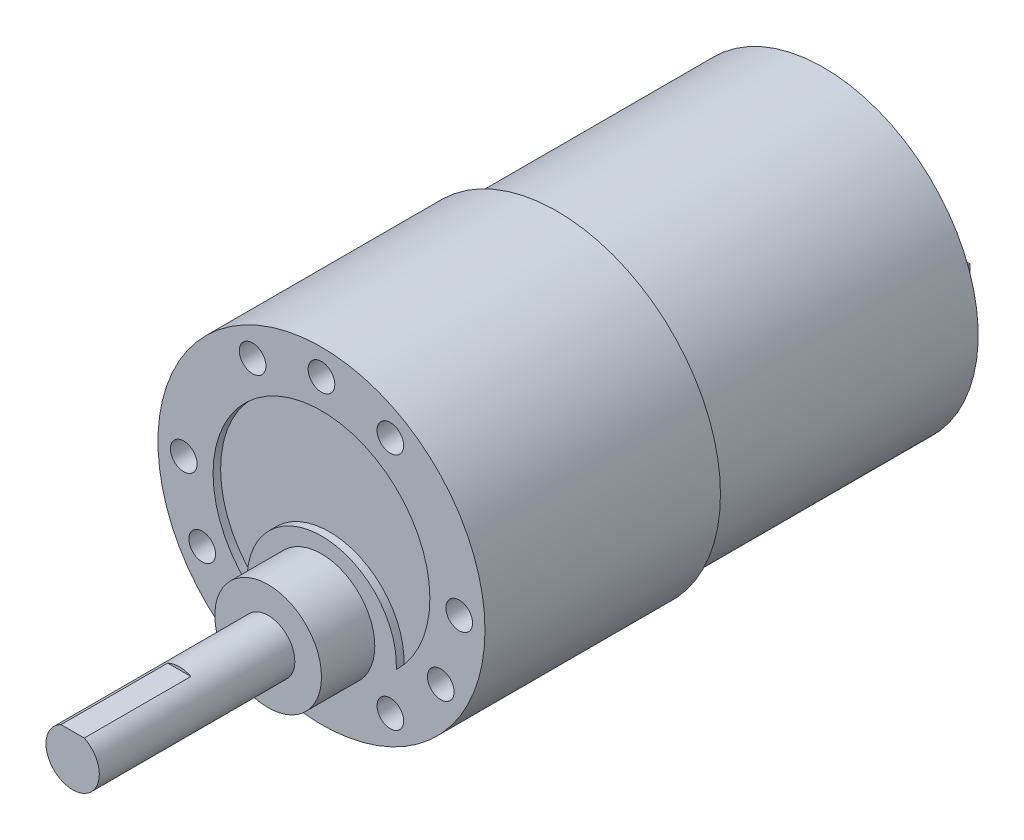
ISO-10303-21;
HEADER;
FILE_DESCRIPTION(('STEP AP214'),'2;1');
FILE_NAME('part.step','',(''),(''),'','','');
FILE_SCHEMA(('AUTOMOTIVE_DESIGN { 1 0 10303 214 1 1 1 1 }'));
ENDSEC;
DATA;
#1=APPLICATION_CONTEXT('core data for automotive mechanical design processes');
#2=APPLICATION_PROTOCOL_DEFINITION('international standard','automotive_design',2000,#1);
#3=PRODUCT_CONTEXT('',#1,'mechanical');
#4=PRODUCT('Part','Part','',(#3));
#5=PRODUCT_RELATED_PRODUCT_CATEGORY('part','',(#4));
#6=PRODUCT_DEFINITION_FORMATION('','',#4);
#7=PRODUCT_DEFINITION_CONTEXT('part definition',#1,'design');
#8=PRODUCT_DEFINITION('design','',#6,#7);
#9=PRODUCT_DEFINITION_SHAPE('','',#8);
#10=(LENGTH_UNIT() NAMED_UNIT(*) SI_UNIT(.MILLI.,.METRE.));
#11=(NAMED_UNIT(*) PLANE_ANGLE_UNIT() SI_UNIT($,.RADIAN.));
#12=(NAMED_UNIT(*) SI_UNIT($,.STERADIAN.) SOLID_ANGLE_UNIT());
#13=UNCERTAINTY_MEASURE_WITH_UNIT(LENGTH_MEASURE(1.E-05),#10,'distance_accuracy_value','');
#14=(GEOMETRIC_REPRESENTATION_CONTEXT(3) GLOBAL_UNCERTAINTY_ASSIGNED_CONTEXT((#13)) GLOBAL_UNIT_ASSIGNED_CONTEXT((#10,
#11,#12)) REPRESENTATION_CONTEXT('',''));
#15=CARTESIAN_POINT('',(0.,0.,0.));
#16=DIRECTION('',(0.,0.,1.));
#17=DIRECTION('',(1.,0.,0.));
#18=AXIS2_PLACEMENT_3D('',#15,#16,#17);
#19=CARTESIAN_POINT('',(0.,0.,-30.));
#20=DIRECTION('',(0.,0.,-1.));
#21=DIRECTION('',(-1.,0.,0.));
#22=AXIS2_PLACEMENT_3D('',#19,#20,#21);
#23=PLANE('',#22);
#24=CARTESIAN_POINT('',(11.25,0.,-30.));
#25=DIRECTION('',(0.,0.,-1.));
#26=DIRECTION('',(-1.,0.,0.));
#27=AXIS2_PLACEMENT_3D('',#24,#25,#26);
#28=CIRCLE('',#27,2.25);
#29=CARTESIAN_POINT('',(9.,0.,-30.));
#30=VERTEX_POINT('',#29);
#31=EDGE_CURVE('E215',#30,#30,#28,.T.);
#32=ORIENTED_EDGE('',*,*,#31,.F.);
#33=EDGE_LOOP('',(#32));
#34=FACE_BOUND('',#33,.T.);
#35=CARTESIAN_POINT('',(0.,0.,-30.));
#36=DIRECTION('',(0.,0.,-1.));
#37=DIRECTION('',(-1.,0.,0.));
#38=AXIS2_PLACEMENT_3D('',#35,#36,#37);
#39=CIRCLE('',#38,3.9);
#40=CARTESIAN_POINT('',(-3.9,0.,-30.));
#41=VERTEX_POINT('',#40);
#42=EDGE_CURVE('E12',#41,#41,#39,.T.);
#43=ORIENTED_EDGE('',*,*,#42,.F.);
#44=EDGE_LOOP('',(#43));
#45=FACE_BOUND('',#44,.T.);
#46=CARTESIAN_POINT('',(0.,0.,-30.));
#47=DIRECTION('',(0.,0.,-1.));
#48=DIRECTION('',(-1.,0.,0.));
#49=AXIS2_PLACEMENT_3D('',#46,#47,#48);
#50=CIRCLE('',#49,17.4);
#51=CARTESIAN_POINT('',(-17.4,0.,-30.));
#52=VERTEX_POINT('',#51);
#53=EDGE_CURVE('E223',#52,#52,#50,.T.);
#54=ORIENTED_EDGE('',*,*,#53,.T.);
#55=EDGE_LOOP('',(#54));
#56=FACE_BOUND('',#55,.T.);
#57=CARTESIAN_POINT('',(-11.25,0.,-30.));
#58=DIRECTION('',(0.,0.,-1.));
#59=DIRECTION('',(1.,0.,0.));
#60=AXIS2_PLACEMENT_3D('',#57,#58,#59);
#61=CIRCLE('',#60,2.25);
#62=CARTESIAN_POINT('',(-9.,0.,-30.));
#63=VERTEX_POINT('',#62);
#64=EDGE_CURVE('E197',#63,#63,#61,.T.);
#65=ORIENTED_EDGE('',*,*,#64,.F.);
#66=EDGE_LOOP('',(#65));
#67=FACE_BOUND('',#66,.T.);
#68=ADVANCED_FACE('F46',(#34,#45,#56,#67),#23,.T.);
#69=CARTESIAN_POINT('',(0.,0.,26.5));
#70=DIRECTION('',(0.,0.,-1.));
#71=DIRECTION('',(-1.,0.,0.));
#72=AXIS2_PLACEMENT_3D('',#69,#70,#71);
#73=CYLINDRICAL_SURFACE('',#72,18.4);
#74=CARTESIAN_POINT('',(0.,0.,26.5));
#75=DIRECTION('',(0.,0.,1.));
#76=DIRECTION('',(1.,0.,0.));
#77=AXIS2_PLACEMENT_3D('',#74,#75,#76);
#78=CIRCLE('',#77,18.4);
#79=CARTESIAN_POINT('',(18.4,0.,26.5));
#80=VERTEX_POINT('',#79);
#81=EDGE_CURVE('E247',#80,#80,#78,.T.);
#82=ORIENTED_EDGE('',*,*,#81,.F.);
#83=EDGE_LOOP('',(#82));
#84=FACE_BOUND('',#83,.T.);
#85=CARTESIAN_POINT('',(0.,0.,0.));
#86=DIRECTION('',(0.,0.,1.));
#87=DIRECTION('',(1.,0.,0.));
#88=AXIS2_PLACEMENT_3D('',#85,#86,#87);
#89=CIRCLE('',#88,18.4);
#90=CARTESIAN_POINT('',(18.4,0.,0.));
#91=VERTEX_POINT('',#90);
#92=EDGE_CURVE('E50',#91,#91,#89,.T.);
#93=ORIENTED_EDGE('',*,*,#92,.T.);
#94=EDGE_LOOP('',(#93));
#95=FACE_BOUND('',#94,.T.);
#96=ADVANCED_FACE('F48',(#84,#95),#73,.T.);
#97=CARTESIAN_POINT('',(0.,0.,26.5));
#98=DIRECTION('',(0.,0.,1.));
#99=DIRECTION('',(1.,0.,0.));
#100=AXIS2_PLACEMENT_3D('',#97,#98,#99);
#101=PLANE('',#100);
#102=CARTESIAN_POINT('',(-1.78589781851884E-12,-7.75000000000207,26.5));
#103=DIRECTION('',(0.,0.,1.));
#104=DIRECTION('',(1.,0.,0.));
#105=AXIS2_PLACEMENT_3D('',#102,#103,#104);
#106=CIRCLE('',#105,6.);
#107=CARTESIAN_POINT('',(5.99999999999821,-7.75000000000207,26.5));
#108=VERTEX_POINT('',#107);
#109=EDGE_CURVE('E244',#108,#108,#106,.T.);
#110=ORIENTED_EDGE('',*,*,#109,.F.);
#111=EDGE_LOOP('',(#110));
#112=FACE_BOUND('',#111,.T.);
#113=CARTESIAN_POINT('',(-15.5,0.,26.5));
#114=DIRECTION('',(0.,0.,1.));
#115=DIRECTION('',(1.,0.,0.));
#116=AXIS2_PLACEMENT_3D('',#113,#114,#115);
#117=CIRCLE('',#116,1.5);
#118=CARTESIAN_POINT('',(-14.,0.,26.5));
#119=VERTEX_POINT('',#118);
#120=EDGE_CURVE('E258',#119,#119,#117,.T.);
#121=ORIENTED_EDGE('',*,*,#120,.F.);
#122=EDGE_LOOP('',(#121));
#123=FACE_BOUND('',#122,.T.);
#124=CARTESIAN_POINT('',(-7.75000000000016,-13.4233937586587,26.5));
#125=DIRECTION('',(0.,0.,1.));
#126=DIRECTION('',(1.,0.,0.));
#127=AXIS2_PLACEMENT_3D('',#124,#125,#126);
#128=CIRCLE('',#127,1.5);
#129=CARTESIAN_POINT('',(-6.25000000000015,-13.4233937586587,26.5));
#130=VERTEX_POINT('',#129);
#131=EDGE_CURVE('E251',#130,#130,#128,.T.);
#132=ORIENTED_EDGE('',*,*,#131,.F.);
#133=EDGE_LOOP('',(#132));
#134=FACE_BOUND('',#133,.T.);
#135=CARTESIAN_POINT('',(7.74999999999987,-13.4233937586589,26.5));
#136=DIRECTION('',(0.,0.,1.));
#137=DIRECTION('',(1.,0.,0.));
#138=AXIS2_PLACEMENT_3D('',#135,#136,#137);
#139=CIRCLE('',#138,1.5);
#140=CARTESIAN_POINT('',(9.24999999999988,-13.4233937586589,26.5));
#141=VERTEX_POINT('',#140);
#142=EDGE_CURVE('E265',#141,#141,#139,.T.);
#143=ORIENTED_EDGE('',*,*,#142,.F.);
#144=EDGE_LOOP('',(#143));
#145=FACE_BOUND('',#144,.T.);
#146=CARTESIAN_POINT('',(15.5,-1.08235921504137E-13,26.5));
#147=DIRECTION('',(0.,0.,1.));
#148=DIRECTION('',(1.,0.,0.));
#149=AXIS2_PLACEMENT_3D('',#146,#147,#148);
#150=CIRCLE('',#149,1.5);
#151=CARTESIAN_POINT('',(17.,-1.08235921504137E-13,26.5));
#152=VERTEX_POINT('',#151);
#153=EDGE_CURVE('E282',#152,#152,#150,.T.);
#154=ORIENTED_EDGE('',*,*,#153,.F.);
#155=EDGE_LOOP('',(#154));
#156=FACE_BOUND('',#155,.T.);
#157=CARTESIAN_POINT('',(7.75000000000006,13.4233937586588,26.5));
#158=DIRECTION('',(0.,0.,1.));
#159=DIRECTION('',(1.,0.,0.));
#160=AXIS2_PLACEMENT_3D('',#157,#158,#159);
#161=CIRCLE('',#160,1.5);
#162=CARTESIAN_POINT('',(9.25000000000006,13.4233937586588,26.5));
#163=VERTEX_POINT('',#162);
#164=EDGE_CURVE('E276',#163,#163,#161,.T.);
#165=ORIENTED_EDGE('',*,*,#164,.F.);
#166=EDGE_LOOP('',(#165));
#167=FACE_BOUND('',#166,.T.);
#168=CARTESIAN_POINT('',(-7.74999999999997,13.4233937586588,26.5));
#169=DIRECTION('',(0.,0.,1.));
#170=DIRECTION('',(1.,0.,0.));
#171=AXIS2_PLACEMENT_3D('',#168,#169,#170);
#172=CIRCLE('',#171,1.5);
#173=CARTESIAN_POINT('',(-6.24999999999997,13.4233937586588,26.5));
#174=VERTEX_POINT('',#173);
#175=EDGE_CURVE('E270',#174,#174,#172,.T.);
#176=ORIENTED_EDGE('',*,*,#175,.F.);
#177=EDGE_LOOP('',(#176));
#178=FACE_BOUND('',#177,.T.);
#179=CARTESIAN_POINT('',(0.,15.5,26.5));
#180=DIRECTION('',(0.,0.,1.));
#181=DIRECTION('',(1.,0.,0.));
#182=AXIS2_PLACEMENT_3D('',#179,#180,#181);
#183=CIRCLE('',#182,1.5);
#184=CARTESIAN_POINT('',(1.5,15.5,26.5));
#185=VERTEX_POINT('',#184);
#186=EDGE_CURVE('E294',#185,#185,#183,.T.);
#187=ORIENTED_EDGE('',*,*,#186,.F.);
#188=EDGE_LOOP('',(#187));
#189=FACE_BOUND('',#188,.T.);
#190=CARTESIAN_POINT('',(13.4233937586576,-7.75000000000207,26.5));
#191=DIRECTION('',(0.,0.,1.));
#192=DIRECTION('',(1.,0.,0.));
#193=AXIS2_PLACEMENT_3D('',#190,#191,#192);
#194=CIRCLE('',#193,1.49999999999779);
#195=CARTESIAN_POINT('',(14.9233937586554,-7.75000000000207,26.5));
#196=VERTEX_POINT('',#195);
#197=EDGE_CURVE('E300',#196,#196,#194,.T.);
#198=ORIENTED_EDGE('',*,*,#197,.F.);
#199=EDGE_LOOP('',(#198));
#200=FACE_BOUND('',#199,.T.);
#201=CARTESIAN_POINT('',(-13.4233937586612,-7.74999999999587,26.5));
#202=DIRECTION('',(0.,0.,1.));
#203=DIRECTION('',(1.,0.,0.));
#204=AXIS2_PLACEMENT_3D('',#201,#202,#203);
#205=CIRCLE('',#204,1.49999999999558);
#206=CARTESIAN_POINT('',(-11.9233937586656,-7.74999999999587,26.5));
#207=VERTEX_POINT('',#206);
#208=EDGE_CURVE('E257',#207,#207,#205,.T.);
#209=ORIENTED_EDGE('',*,*,#208,.F.);
#210=EDGE_LOOP('',(#209));
#211=FACE_BOUND('',#210,.T.);
#212=CARTESIAN_POINT('',(0.0300122031200254,-8.39994638480889,26.5));
#213=DIRECTION('',(0.,0.,1.));
#214=DIRECTION('',(1.,0.,0.));
#215=AXIS2_PLACEMENT_3D('',#212,#213,#214);
#216=CIRCLE('',#215,8.4);
#217=CARTESIAN_POINT('',(-8.35571384552702,-8.88943452260424,26.5));
#218=VERTEX_POINT('',#217);
#219=CARTESIAN_POINT('',(8.41902189984086,-8.8295,26.5));
#220=VERTEX_POINT('',#219);
#221=EDGE_CURVE('E71',#218,#220,#216,.F.);
#222=ORIENTED_EDGE('',*,*,#221,.F.);
#223=CARTESIAN_POINT('',(0.,0.,26.5));
#224=DIRECTION('',(0.,0.,1.));
#225=DIRECTION('',(1.,0.,0.));
#226=AXIS2_PLACEMENT_3D('',#223,#224,#225);
#227=CIRCLE('',#226,12.2);
#228=EDGE_CURVE('E293',#220,#218,#227,.T.);
#229=ORIENTED_EDGE('',*,*,#228,.F.);
#230=EDGE_LOOP('',(#222,#229));
#231=FACE_BOUND('',#230,.T.);
#232=ORIENTED_EDGE('',*,*,#81,.T.);
#233=EDGE_LOOP('',(#232));
#234=FACE_BOUND('',#233,.T.);
#235=ADVANCED_FACE('F330',(#112,#123,#134,#145,#156,#167,#178,#189,#200,#211,#231,#234),#101,.T.);
#236=CARTESIAN_POINT('',(0.,0.,0.));
#237=DIRECTION('',(0.,0.,1.));
#238=DIRECTION('',(1.,0.,0.));
#239=AXIS2_PLACEMENT_3D('',#236,#237,#238);
#240=PLANE('',#239);
#241=CARTESIAN_POINT('',(0.,0.,0.));
#242=DIRECTION('',(0.,0.,-1.));
#243=DIRECTION('',(-1.,0.,0.));
#244=AXIS2_PLACEMENT_3D('',#241,#242,#243);
#245=CIRCLE('',#244,17.4);
#246=CARTESIAN_POINT('',(-17.4,0.,0.));
#247=VERTEX_POINT('',#246);
#248=EDGE_CURVE('E55',#247,#247,#245,.T.);
#249=ORIENTED_EDGE('',*,*,#248,.F.);
#250=EDGE_LOOP('',(#249));
#251=FACE_BOUND('',#250,.T.);
#252=ORIENTED_EDGE('',*,*,#92,.F.);
#253=EDGE_LOOP('',(#252));
#254=FACE_BOUND('',#253,.T.);
#255=ADVANCED_FACE('F327',(#251,#254),#240,.F.);
#256=CARTESIAN_POINT('',(0.0300122031200254,-8.39994638480889,25.65));
#257=DIRECTION('',(0.,0.,1.));
#258=DIRECTION('',(1.,0.,0.));
#259=AXIS2_PLACEMENT_3D('',#256,#257,#258);
#260=CYLINDRICAL_SURFACE('',#259,8.4);
#261=ORIENTED_EDGE('',*,*,#221,.T.);
#262=DIRECTION('',(0.,0.,1.));
#263=VECTOR('',#262,1.);
#264=CARTESIAN_POINT('',(8.41902189984086,-8.8295,25.65));
#265=LINE('',#264,#263);
#266=CARTESIAN_POINT('',(8.41902189984086,-8.8295,25.65));
#267=VERTEX_POINT('',#266);
#268=EDGE_CURVE('E318',#267,#220,#265,.T.);
#269=ORIENTED_EDGE('',*,*,#268,.F.);
#270=CARTESIAN_POINT('',(0.0300122031200254,-8.39994638480889,25.65));
#271=DIRECTION('',(0.,0.,1.));
#272=DIRECTION('',(1.,0.,0.));
#273=AXIS2_PLACEMENT_3D('',#270,#271,#272);
#274=CIRCLE('',#273,8.4);
#275=CARTESIAN_POINT('',(-8.35571384552702,-8.88943452260424,25.65));
#276=VERTEX_POINT('',#275);
#277=EDGE_CURVE('E311',#276,#267,#274,.F.);
#278=ORIENTED_EDGE('',*,*,#277,.F.);
#279=DIRECTION('',(0.,0.,1.));
#280=VECTOR('',#279,1.);
#281=CARTESIAN_POINT('',(-8.35571384552702,-8.88943452260424,25.65));
#282=LINE('',#281,#280);
#283=EDGE_CURVE('E314',#276,#218,#282,.T.);
#284=ORIENTED_EDGE('',*,*,#283,.T.);
#285=EDGE_LOOP('',(#261,#269,#278,#284));
#286=FACE_BOUND('',#285,.T.);
#287=ADVANCED_FACE('F329',(#286),#260,.T.);
#288=CARTESIAN_POINT('',(0.,0.,25.65));
#289=DIRECTION('',(0.,0.,1.));
#290=DIRECTION('',(1.,0.,0.));
#291=AXIS2_PLACEMENT_3D('',#288,#289,#290);
#292=CYLINDRICAL_SURFACE('',#291,12.2);
#293=ORIENTED_EDGE('',*,*,#228,.T.);
#294=ORIENTED_EDGE('',*,*,#283,.F.);
#295=CARTESIAN_POINT('',(0.,0.,25.65));
#296=DIRECTION('',(0.,0.,1.));
#297=DIRECTION('',(1.,0.,0.));
#298=AXIS2_PLACEMENT_3D('',#295,#296,#297);
#299=CIRCLE('',#298,12.2);
#300=EDGE_CURVE('E308',#267,#276,#299,.T.);
#301=ORIENTED_EDGE('',*,*,#300,.F.);
#302=ORIENTED_EDGE('',*,*,#268,.T.);
#303=EDGE_LOOP('',(#293,#294,#301,#302));
#304=FACE_BOUND('',#303,.T.);
#305=ADVANCED_FACE('F336',(#304),#292,.F.);
#306=CARTESIAN_POINT('',(0.,0.,25.65));
#307=DIRECTION('',(0.,0.,1.));
#308=DIRECTION('',(1.,0.,0.));
#309=AXIS2_PLACEMENT_3D('',#306,#307,#308);
#310=PLANE('',#309);
#311=ORIENTED_EDGE('',*,*,#300,.T.);
#312=ORIENTED_EDGE('',*,*,#277,.T.);
#313=EDGE_LOOP('',(#311,#312));
#314=FACE_BOUND('',#313,.T.);
#315=ADVANCED_FACE('F452',(#314),#310,.T.);
#316=CARTESIAN_POINT('',(-13.4233937586612,-7.74999999999587,1.5));
#317=DIRECTION('',(0.,0.,1.));
#318=DIRECTION('',(1.,0.,0.));
#319=AXIS2_PLACEMENT_3D('',#316,#317,#318);
#320=CYLINDRICAL_SURFACE('',#319,1.49999999999558);
#321=CARTESIAN_POINT('',(-13.4233937586612,-7.74999999999587,1.5));
#322=DIRECTION('',(0.,0.,1.));
#323=DIRECTION('',(1.,0.,0.));
#324=AXIS2_PLACEMENT_3D('',#321,#322,#323);
#325=CIRCLE('',#324,1.49999999999558);
#326=CARTESIAN_POINT('',(-11.9233937586656,-7.74999999999587,1.5));
#327=VERTEX_POINT('',#326);
#328=EDGE_CURVE('E303',#327,#327,#325,.T.);
#329=ORIENTED_EDGE('',*,*,#328,.F.);
#330=EDGE_LOOP('',(#329));
#331=FACE_BOUND('',#330,.T.);
#332=ORIENTED_EDGE('',*,*,#208,.T.);
#333=EDGE_LOOP('',(#332));
#334=FACE_BOUND('',#333,.T.);
#335=ADVANCED_FACE('F448',(#331,#334),#320,.F.);
#336=CARTESIAN_POINT('',(-13.4233937586612,-7.74999999999587,1.5));
#337=DIRECTION('',(0.,0.,1.));
#338=DIRECTION('',(1.,0.,0.));
#339=AXIS2_PLACEMENT_3D('',#336,#337,#338);
#340=PLANE('',#339);
#341=ORIENTED_EDGE('',*,*,#328,.T.);
#342=EDGE_LOOP('',(#341));
#343=FACE_BOUND('',#342,.T.);
#344=ADVANCED_FACE('F444',(#343),#340,.T.);
#345=CARTESIAN_POINT('',(13.4233937586576,-7.75000000000207,1.5));
#346=DIRECTION('',(0.,0.,1.));
#347=DIRECTION('',(1.,0.,0.));
#348=AXIS2_PLACEMENT_3D('',#345,#346,#347);
#349=CYLINDRICAL_SURFACE('',#348,1.49999999999779);
#350=CARTESIAN_POINT('',(13.4233937586576,-7.75000000000207,1.5));
#351=DIRECTION('',(0.,0.,1.));
#352=DIRECTION('',(1.,0.,0.));
#353=AXIS2_PLACEMENT_3D('',#350,#351,#352);
#354=CIRCLE('',#353,1.49999999999779);
#355=CARTESIAN_POINT('',(14.9233937586554,-7.75000000000207,1.5));
#356=VERTEX_POINT('',#355);
#357=EDGE_CURVE('E297',#356,#356,#354,.T.);
#358=ORIENTED_EDGE('',*,*,#357,.F.);
#359=EDGE_LOOP('',(#358));
#360=FACE_BOUND('',#359,.T.);
#361=ORIENTED_EDGE('',*,*,#197,.T.);
#362=EDGE_LOOP('',(#361));
#363=FACE_BOUND('',#362,.T.);
#364=ADVANCED_FACE('F440',(#360,#363),#349,.F.);
#365=CARTESIAN_POINT('',(13.4233937586576,-7.75000000000207,1.5));
#366=DIRECTION('',(0.,0.,1.));
#367=DIRECTION('',(1.,0.,0.));
#368=AXIS2_PLACEMENT_3D('',#365,#366,#367);
#369=PLANE('',#368);
#370=ORIENTED_EDGE('',*,*,#357,.T.);
#371=EDGE_LOOP('',(#370));
#372=FACE_BOUND('',#371,.T.);
#373=ADVANCED_FACE('F436',(#372),#369,.T.);
#374=CARTESIAN_POINT('',(0.,15.5,1.5));
#375=DIRECTION('',(0.,0.,1.));
#376=DIRECTION('',(1.,0.,0.));
#377=AXIS2_PLACEMENT_3D('',#374,#375,#376);
#378=CYLINDRICAL_SURFACE('',#377,1.5);
#379=CARTESIAN_POINT('',(0.,15.5,1.5));
#380=DIRECTION('',(0.,0.,1.));
#381=DIRECTION('',(1.,0.,0.));
#382=AXIS2_PLACEMENT_3D('',#379,#380,#381);
#383=CIRCLE('',#382,1.5);
#384=CARTESIAN_POINT('',(1.5,15.5,1.5));
#385=VERTEX_POINT('',#384);
#386=EDGE_CURVE('E290',#385,#385,#383,.T.);
#387=ORIENTED_EDGE('',*,*,#386,.F.);
#388=EDGE_LOOP('',(#387));
#389=FACE_BOUND('',#388,.T.);
#390=ORIENTED_EDGE('',*,*,#186,.T.);
#391=EDGE_LOOP('',(#390));
#392=FACE_BOUND('',#391,.T.);
#393=ADVANCED_FACE('F432',(#389,#392),#378,.F.);
#394=CARTESIAN_POINT('',(0.,15.5,1.5));
#395=DIRECTION('',(0.,0.,1.));
#396=DIRECTION('',(1.,0.,0.));
#397=AXIS2_PLACEMENT_3D('',#394,#395,#396);
#398=PLANE('',#397);
#399=ORIENTED_EDGE('',*,*,#386,.T.);
#400=EDGE_LOOP('',(#399));
#401=FACE_BOUND('',#400,.T.);
#402=ADVANCED_FACE('F406',(#401),#398,.T.);
#403=CARTESIAN_POINT('',(-7.74999999999997,13.4233937586588,21.5));
#404=DIRECTION('',(0.,0.,1.));
#405=DIRECTION('',(1.,0.,0.));
#406=AXIS2_PLACEMENT_3D('',#403,#404,#405);
#407=CYLINDRICAL_SURFACE('',#406,1.5);
#408=CARTESIAN_POINT('',(-7.74999999999997,13.4233937586588,21.5));
#409=DIRECTION('',(0.,0.,1.));
#410=DIRECTION('',(1.,0.,0.));
#411=AXIS2_PLACEMENT_3D('',#408,#409,#410);
#412=CIRCLE('',#411,1.5);
#413=CARTESIAN_POINT('',(-6.24999999999997,13.4233937586588,21.5));
#414=VERTEX_POINT('',#413);
#415=EDGE_CURVE('E261',#414,#414,#412,.T.);
#416=ORIENTED_EDGE('',*,*,#415,.F.);
#417=EDGE_LOOP('',(#416));
#418=FACE_BOUND('',#417,.T.);
#419=ORIENTED_EDGE('',*,*,#175,.T.);
#420=EDGE_LOOP('',(#419));
#421=FACE_BOUND('',#420,.T.);
#422=ADVANCED_FACE('F402',(#418,#421),#407,.F.);
#423=CARTESIAN_POINT('',(-7.74999999999997,13.4233937586588,21.5));
#424=DIRECTION('',(0.,0.,1.));
#425=DIRECTION('',(1.,0.,0.));
#426=AXIS2_PLACEMENT_3D('',#423,#424,#425);
#427=PLANE('',#426);
#428=ORIENTED_EDGE('',*,*,#415,.T.);
#429=EDGE_LOOP('',(#428));
#430=FACE_BOUND('',#429,.T.);
#431=ADVANCED_FACE('F398',(#430),#427,.T.);
#432=CARTESIAN_POINT('',(7.75000000000006,13.4233937586588,21.5));
#433=DIRECTION('',(0.,0.,1.));
#434=DIRECTION('',(1.,0.,0.));
#435=AXIS2_PLACEMENT_3D('',#432,#433,#434);
#436=CYLINDRICAL_SURFACE('',#435,1.5);
#437=CARTESIAN_POINT('',(7.75000000000006,13.4233937586588,21.5));
#438=DIRECTION('',(0.,0.,1.));
#439=DIRECTION('',(1.,0.,0.));
#440=AXIS2_PLACEMENT_3D('',#437,#438,#439);
#441=CIRCLE('',#440,1.5);
#442=CARTESIAN_POINT('',(9.25000000000006,13.4233937586588,21.5));
#443=VERTEX_POINT('',#442);
#444=EDGE_CURVE('E273',#443,#443,#441,.T.);
#445=ORIENTED_EDGE('',*,*,#444,.F.);
#446=EDGE_LOOP('',(#445));
#447=FACE_BOUND('',#446,.T.);
#448=ORIENTED_EDGE('',*,*,#164,.T.);
#449=EDGE_LOOP('',(#448));
#450=FACE_BOUND('',#449,.T.);
#451=ADVANCED_FACE('F401',(#447,#450),#436,.F.);
#452=CARTESIAN_POINT('',(7.75000000000006,13.4233937586588,21.5));
#453=DIRECTION('',(0.,0.,1.));
#454=DIRECTION('',(1.,0.,0.));
#455=AXIS2_PLACEMENT_3D('',#452,#453,#454);
#456=PLANE('',#455);
#457=ORIENTED_EDGE('',*,*,#444,.T.);
#458=EDGE_LOOP('',(#457));
#459=FACE_BOUND('',#458,.T.);
#460=ADVANCED_FACE('F408',(#459),#456,.T.);
#461=CARTESIAN_POINT('',(15.5,-1.08235921504137E-13,21.5));
#462=DIRECTION('',(0.,0.,1.));
#463=DIRECTION('',(1.,0.,0.));
#464=AXIS2_PLACEMENT_3D('',#461,#462,#463);
#465=CYLINDRICAL_SURFACE('',#464,1.5);
#466=CARTESIAN_POINT('',(15.5,-1.08235921504137E-13,21.5));
#467=DIRECTION('',(0.,0.,1.));
#468=DIRECTION('',(1.,0.,0.));
#469=AXIS2_PLACEMENT_3D('',#466,#467,#468);
#470=CIRCLE('',#469,1.5);
#471=CARTESIAN_POINT('',(17.,-1.08235921504137E-13,21.5));
#472=VERTEX_POINT('',#471);
#473=EDGE_CURVE('E279',#472,#472,#470,.T.);
#474=ORIENTED_EDGE('',*,*,#473,.F.);
#475=EDGE_LOOP('',(#474));
#476=FACE_BOUND('',#475,.T.);
#477=ORIENTED_EDGE('',*,*,#153,.T.);
#478=EDGE_LOOP('',(#477));
#479=FACE_BOUND('',#478,.T.);
#480=ADVANCED_FACE('F411',(#476,#479),#465,.F.);
#481=CARTESIAN_POINT('',(15.5,-1.08235921504137E-13,21.5));
#482=DIRECTION('',(0.,0.,1.));
#483=DIRECTION('',(1.,0.,0.));
#484=AXIS2_PLACEMENT_3D('',#481,#482,#483);
#485=PLANE('',#484);
#486=ORIENTED_EDGE('',*,*,#473,.T.);
#487=EDGE_LOOP('',(#486));
#488=FACE_BOUND('',#487,.T.);
#489=ADVANCED_FACE('F416',(#488),#485,.T.);
#490=CARTESIAN_POINT('',(7.74999999999987,-13.4233937586589,21.5));
#491=DIRECTION('',(0.,0.,1.));
#492=DIRECTION('',(1.,0.,0.));
#493=AXIS2_PLACEMENT_3D('',#490,#491,#492);
#494=CYLINDRICAL_SURFACE('',#493,1.5);
#495=CARTESIAN_POINT('',(7.74999999999987,-13.4233937586589,21.5));
#496=DIRECTION('',(0.,0.,1.));
#497=DIRECTION('',(1.,0.,0.));
#498=AXIS2_PLACEMENT_3D('',#495,#496,#497);
#499=CIRCLE('',#498,1.5);
#500=CARTESIAN_POINT('',(9.24999999999988,-13.4233937586589,21.5));
#501=VERTEX_POINT('',#500);
#502=EDGE_CURVE('E285',#501,#501,#499,.T.);
#503=ORIENTED_EDGE('',*,*,#502,.F.);
#504=EDGE_LOOP('',(#503));
#505=FACE_BOUND('',#504,.T.);
#506=ORIENTED_EDGE('',*,*,#142,.T.);
#507=EDGE_LOOP('',(#506));
#508=FACE_BOUND('',#507,.T.);
#509=ADVANCED_FACE('F419',(#505,#508),#494,.F.);
#510=CARTESIAN_POINT('',(7.74999999999987,-13.4233937586589,21.5));
#511=DIRECTION('',(0.,0.,1.));
#512=DIRECTION('',(1.,0.,0.));
#513=AXIS2_PLACEMENT_3D('',#510,#511,#512);
#514=PLANE('',#513);
#515=ORIENTED_EDGE('',*,*,#502,.T.);
#516=EDGE_LOOP('',(#515));
#517=FACE_BOUND('',#516,.T.);
#518=ADVANCED_FACE('F396',(#517),#514,.T.);
#519=CARTESIAN_POINT('',(-7.75000000000016,-13.4233937586587,21.5));
#520=DIRECTION('',(0.,0.,1.));
#521=DIRECTION('',(1.,0.,0.));
#522=AXIS2_PLACEMENT_3D('',#519,#520,#521);
#523=CYLINDRICAL_SURFACE('',#522,1.5);
#524=CARTESIAN_POINT('',(-7.75000000000016,-13.4233937586587,21.5));
#525=DIRECTION('',(0.,0.,1.));
#526=DIRECTION('',(1.,0.,0.));
#527=AXIS2_PLACEMENT_3D('',#524,#525,#526);
#528=CIRCLE('',#527,1.5);
#529=CARTESIAN_POINT('',(-6.25000000000015,-13.4233937586587,21.5));
#530=VERTEX_POINT('',#529);
#531=EDGE_CURVE('E262',#530,#530,#528,.T.);
#532=ORIENTED_EDGE('',*,*,#531,.F.);
#533=EDGE_LOOP('',(#532));
#534=FACE_BOUND('',#533,.T.);
#535=ORIENTED_EDGE('',*,*,#131,.T.);
#536=EDGE_LOOP('',(#535));
#537=FACE_BOUND('',#536,.T.);
#538=ADVANCED_FACE('F392',(#534,#537),#523,.F.);
#539=CARTESIAN_POINT('',(-7.75000000000016,-13.4233937586587,21.5));
#540=DIRECTION('',(0.,0.,1.));
#541=DIRECTION('',(1.,0.,0.));
#542=AXIS2_PLACEMENT_3D('',#539,#540,#541);
#543=PLANE('',#542);
#544=ORIENTED_EDGE('',*,*,#531,.T.);
#545=EDGE_LOOP('',(#544));
#546=FACE_BOUND('',#545,.T.);
#547=ADVANCED_FACE('F388',(#546),#543,.T.);
#548=CARTESIAN_POINT('',(-15.5,0.,21.5));
#549=DIRECTION('',(0.,0.,1.));
#550=DIRECTION('',(1.,0.,0.));
#551=AXIS2_PLACEMENT_3D('',#548,#549,#550);
#552=CYLINDRICAL_SURFACE('',#551,1.5);
#553=CARTESIAN_POINT('',(-15.5,0.,21.5));
#554=DIRECTION('',(0.,0.,1.));
#555=DIRECTION('',(1.,0.,0.));
#556=AXIS2_PLACEMENT_3D('',#553,#554,#555);
#557=CIRCLE('',#556,1.5);
#558=CARTESIAN_POINT('',(-14.,0.,21.5));
#559=VERTEX_POINT('',#558);
#560=EDGE_CURVE('E254',#559,#559,#557,.T.);
#561=ORIENTED_EDGE('',*,*,#560,.F.);
#562=EDGE_LOOP('',(#561));
#563=FACE_BOUND('',#562,.T.);
#564=ORIENTED_EDGE('',*,*,#120,.T.);
#565=EDGE_LOOP('',(#564));
#566=FACE_BOUND('',#565,.T.);
#567=ADVANCED_FACE('F384',(#563,#566),#552,.F.);
#568=CARTESIAN_POINT('',(-15.5,0.,21.5));
#569=DIRECTION('',(0.,0.,1.));
#570=DIRECTION('',(1.,0.,0.));
#571=AXIS2_PLACEMENT_3D('',#568,#569,#570);
#572=PLANE('',#571);
#573=ORIENTED_EDGE('',*,*,#560,.T.);
#574=EDGE_LOOP('',(#573));
#575=FACE_BOUND('',#574,.T.);
#576=ADVANCED_FACE('F380',(#575),#572,.T.);
#577=CARTESIAN_POINT('',(-1.78589781851884E-12,-7.75000000000207,32.5));
#578=DIRECTION('',(0.,0.,-1.));
#579=DIRECTION('',(-1.,0.,0.));
#580=AXIS2_PLACEMENT_3D('',#577,#578,#579);
#581=CYLINDRICAL_SURFACE('',#580,6.);
#582=CARTESIAN_POINT('',(-1.78589781851884E-12,-7.75000000000207,32.5));
#583=DIRECTION('',(0.,0.,1.));
#584=DIRECTION('',(1.,0.,0.));
#585=AXIS2_PLACEMENT_3D('',#582,#583,#584);
#586=CIRCLE('',#585,6.);
#587=CARTESIAN_POINT('',(5.99999999999821,-7.75000000000207,32.5));
#588=VERTEX_POINT('',#587);
#589=EDGE_CURVE('E248',#588,#588,#586,.T.);
#590=ORIENTED_EDGE('',*,*,#589,.F.);
#591=EDGE_LOOP('',(#590));
#592=FACE_BOUND('',#591,.T.);
#593=ORIENTED_EDGE('',*,*,#109,.T.);
#594=EDGE_LOOP('',(#593));
#595=FACE_BOUND('',#594,.T.);
#596=ADVANCED_FACE('F376',(#592,#595),#581,.T.);
#597=CARTESIAN_POINT('',(-1.78589781851884E-12,-7.75000000000207,32.5));
#598=DIRECTION('',(0.,0.,1.));
#599=DIRECTION('',(1.,0.,0.));
#600=AXIS2_PLACEMENT_3D('',#597,#598,#599);
#601=PLANE('',#600);
#602=CARTESIAN_POINT('',(-1.78589781851884E-12,-7.75000000000207,32.5));
#603=DIRECTION('',(0.,0.,1.));
#604=DIRECTION('',(1.,0.,0.));
#605=AXIS2_PLACEMENT_3D('',#602,#603,#604);
#606=CIRCLE('',#605,3.);
#607=CARTESIAN_POINT('',(2.99999999999821,-7.75000000000207,32.5));
#608=VERTEX_POINT('',#607);
#609=EDGE_CURVE('E230',#608,#608,#606,.T.);
#610=ORIENTED_EDGE('',*,*,#609,.F.);
#611=EDGE_LOOP('',(#610));
#612=FACE_BOUND('',#611,.T.);
#613=ORIENTED_EDGE('',*,*,#589,.T.);
#614=EDGE_LOOP('',(#613));
#615=FACE_BOUND('',#614,.T.);
#616=ADVANCED_FACE('F372',(#612,#615),#601,.T.);
#617=CARTESIAN_POINT('',(-1.78589781851884E-12,-7.75000000000207,54.5));
#618=DIRECTION('',(0.,0.,-1.));
#619=DIRECTION('',(-1.,0.,0.));
#620=AXIS2_PLACEMENT_3D('',#617,#618,#619);
#621=CYLINDRICAL_SURFACE('',#620,3.);
#622=CARTESIAN_POINT('',(-1.78589781851884E-12,-7.75000000000207,54.5));
#623=DIRECTION('',(0.,0.,1.));
#624=DIRECTION('',(1.,0.,0.));
#625=AXIS2_PLACEMENT_3D('',#622,#623,#624);
#626=CIRCLE('',#625,3.);
#627=CARTESIAN_POINT('',(-1.30766968306399,-5.05000000000207,54.5));
#628=VERTEX_POINT('',#627);
#629=CARTESIAN_POINT('',(1.30766968306042,-5.05000000000207,54.5));
#630=VERTEX_POINT('',#629);
#631=EDGE_CURVE('E240',#628,#630,#626,.T.);
#632=ORIENTED_EDGE('',*,*,#631,.F.);
#633=DIRECTION('',(0.,0.,1.));
#634=VECTOR('',#633,1.);
#635=CARTESIAN_POINT('',(-1.30766968306399,-5.05000000000207,42.5));
#636=LINE('',#635,#634);
#637=CARTESIAN_POINT('',(-1.30766968306399,-5.05000000000207,42.5));
#638=VERTEX_POINT('',#637);
#639=EDGE_CURVE('E63',#638,#628,#636,.T.);
#640=ORIENTED_EDGE('',*,*,#639,.F.);
#641=CARTESIAN_POINT('',(-1.78589781851884E-12,-7.75000000000207,42.5));
#642=DIRECTION('',(0.,0.,1.));
#643=DIRECTION('',(1.,0.,0.));
#644=AXIS2_PLACEMENT_3D('',#641,#642,#643);
#645=CIRCLE('',#644,3.);
#646=CARTESIAN_POINT('',(1.30766968306042,-5.05000000000207,42.5));
#647=VERTEX_POINT('',#646);
#648=EDGE_CURVE('E231',#647,#638,#645,.T.);
#649=ORIENTED_EDGE('',*,*,#648,.F.);
#650=DIRECTION('',(0.,0.,1.));
#651=VECTOR('',#650,1.);
#652=CARTESIAN_POINT('',(1.30766968306042,-5.05000000000207,42.5));
#653=LINE('',#652,#651);
#654=EDGE_CURVE('E237',#647,#630,#653,.T.);
#655=ORIENTED_EDGE('',*,*,#654,.T.);
#656=EDGE_LOOP('',(#632,#640,#649,#655));
#657=FACE_BOUND('',#656,.T.);
#658=ORIENTED_EDGE('',*,*,#609,.T.);
#659=EDGE_LOOP('',(#658));
#660=FACE_BOUND('',#659,.T.);
#661=ADVANCED_FACE('F368',(#657,#660),#621,.T.);
#662=CARTESIAN_POINT('',(-1.78589781851884E-12,-7.75000000000207,54.5));
#663=DIRECTION('',(0.,0.,1.));
#664=DIRECTION('',(1.,0.,0.));
#665=AXIS2_PLACEMENT_3D('',#662,#663,#664);
#666=PLANE('',#665);
#667=DIRECTION('',(1.,0.,0.));
#668=VECTOR('',#667,1.);
#669=CARTESIAN_POINT('',(0.,-5.05000000000207,54.5));
#670=LINE('',#669,#668);
#671=EDGE_CURVE('E227',#628,#630,#670,.T.);
#672=ORIENTED_EDGE('',*,*,#671,.F.);
#673=ORIENTED_EDGE('',*,*,#631,.T.);
#674=EDGE_LOOP('',(#672,#673));
#675=FACE_BOUND('',#674,.T.);
#676=ADVANCED_FACE('F365',(#675),#666,.T.);
#677=CARTESIAN_POINT('',(0.,-5.05000000000207,42.5));
#678=DIRECTION('',(0.,-1.,0.));
#679=DIRECTION('',(0.,0.,-1.));
#680=AXIS2_PLACEMENT_3D('',#677,#678,#679);
#681=PLANE('',#680);
#682=ORIENTED_EDGE('',*,*,#671,.T.);
#683=ORIENTED_EDGE('',*,*,#654,.F.);
#684=DIRECTION('',(1.,0.,0.));
#685=VECTOR('',#684,1.);
#686=CARTESIAN_POINT('',(0.,-5.05000000000207,42.5));
#687=LINE('',#686,#685);
#688=EDGE_CURVE('E233',#638,#647,#687,.T.);
#689=ORIENTED_EDGE('',*,*,#688,.F.);
#690=ORIENTED_EDGE('',*,*,#639,.T.);
#691=EDGE_LOOP('',(#682,#683,#689,#690));
#692=FACE_BOUND('',#691,.T.);
#693=ADVANCED_FACE('F361',(#692),#681,.F.);
#694=CARTESIAN_POINT('',(0.,0.,42.5));
#695=DIRECTION('',(0.,0.,1.));
#696=DIRECTION('',(1.,0.,0.));
#697=AXIS2_PLACEMENT_3D('',#694,#695,#696);
#698=PLANE('',#697);
#699=ORIENTED_EDGE('',*,*,#648,.T.);
#700=ORIENTED_EDGE('',*,*,#688,.T.);
#701=EDGE_LOOP('',(#699,#700));
#702=FACE_BOUND('',#701,.T.);
#703=ADVANCED_FACE('F357',(#702),#698,.T.);
#704=CARTESIAN_POINT('',(0.,0.,-30.));
#705=DIRECTION('',(0.,0.,1.));
#706=DIRECTION('',(1.,0.,0.));
#707=AXIS2_PLACEMENT_3D('',#704,#705,#706);
#708=CYLINDRICAL_SURFACE('',#707,17.4);
#709=ORIENTED_EDGE('',*,*,#53,.F.);
#710=EDGE_LOOP('',(#709));
#711=FACE_BOUND('',#710,.T.);
#712=ORIENTED_EDGE('',*,*,#248,.T.);
#713=EDGE_LOOP('',(#712));
#714=FACE_BOUND('',#713,.T.);
#715=ADVANCED_FACE('F354',(#711,#714),#708,.T.);
#716=CARTESIAN_POINT('',(0.,0.,-31.6));
#717=DIRECTION('',(0.,0.,1.));
#718=DIRECTION('',(1.,0.,0.));
#719=AXIS2_PLACEMENT_3D('',#716,#717,#718);
#720=CYLINDRICAL_SURFACE('',#719,3.9);
#721=CARTESIAN_POINT('',(0.,0.,-31.6));
#722=DIRECTION('',(0.,0.,-1.));
#723=DIRECTION('',(-1.,0.,0.));
#724=AXIS2_PLACEMENT_3D('',#721,#722,#723);
#725=CIRCLE('',#724,3.9);
#726=CARTESIAN_POINT('',(-3.9,0.,-31.6));
#727=VERTEX_POINT('',#726);
#728=EDGE_CURVE('E219',#727,#727,#725,.T.);
#729=ORIENTED_EDGE('',*,*,#728,.F.);
#730=EDGE_LOOP('',(#729));
#731=FACE_BOUND('',#730,.T.);
#732=ORIENTED_EDGE('',*,*,#42,.T.);
#733=EDGE_LOOP('',(#732));
#734=FACE_BOUND('',#733,.T.);
#735=ADVANCED_FACE('F352',(#731,#734),#720,.T.);
#736=CARTESIAN_POINT('',(0.,0.,-31.6));
#737=DIRECTION('',(0.,0.,-1.));
#738=DIRECTION('',(-1.,0.,0.));
#739=AXIS2_PLACEMENT_3D('',#736,#737,#738);
#740=PLANE('',#739);
#741=ORIENTED_EDGE('',*,*,#728,.T.);
#742=EDGE_LOOP('',(#741));
#743=FACE_BOUND('',#742,.T.);
#744=ADVANCED_FACE('F578',(#743),#740,.T.);
#745=CARTESIAN_POINT('',(11.25,0.,-31.6));
#746=DIRECTION('',(0.,0.,-1.));
#747=DIRECTION('',(-1.,0.,0.));
#748=AXIS2_PLACEMENT_3D('',#745,#746,#747);
#749=PLANE('',#748);
#750=CARTESIAN_POINT('',(11.25,0.,-31.6));
#751=DIRECTION('',(0.,0.,-1.));
#752=DIRECTION('',(-1.,0.,0.));
#753=AXIS2_PLACEMENT_3D('',#750,#751,#752);
#754=CIRCLE('',#753,2.25);
#755=CARTESIAN_POINT('',(9.,0.,-31.6));
#756=VERTEX_POINT('',#755);
#757=EDGE_CURVE('E216',#756,#756,#754,.T.);
#758=ORIENTED_EDGE('',*,*,#757,.T.);
#759=EDGE_LOOP('',(#758));
#760=FACE_BOUND('',#759,.T.);
#761=DIRECTION('',(1.,0.,0.));
#762=VECTOR('',#761,1.);
#763=CARTESIAN_POINT('',(11.5,1.50000000000001,-31.6));
#764=LINE('',#763,#762);
#765=CARTESIAN_POINT('',(11.,1.50000000000001,-31.6));
#766=VERTEX_POINT('',#765);
#767=CARTESIAN_POINT('',(11.5,1.50000000000001,-31.6));
#768=VERTEX_POINT('',#767);
#769=EDGE_CURVE('E206',#766,#768,#764,.T.);
#770=ORIENTED_EDGE('',*,*,#769,.F.);
#771=DIRECTION('',(0.,1.,0.));
#772=VECTOR('',#771,1.);
#773=CARTESIAN_POINT('',(11.,-1.5,-31.6));
#774=LINE('',#773,#772);
#775=CARTESIAN_POINT('',(11.,-1.5,-31.6));
#776=VERTEX_POINT('',#775);
#777=EDGE_CURVE('E201',#776,#766,#774,.T.);
#778=ORIENTED_EDGE('',*,*,#777,.F.);
#779=DIRECTION('',(-1.,0.,0.));
#780=VECTOR('',#779,1.);
#781=CARTESIAN_POINT('',(11.5,-1.5,-31.6));
#782=LINE('',#781,#780);
#783=CARTESIAN_POINT('',(11.5,-1.5,-31.6));
#784=VERTEX_POINT('',#783);
#785=EDGE_CURVE('E212',#784,#776,#782,.T.);
#786=ORIENTED_EDGE('',*,*,#785,.F.);
#787=DIRECTION('',(0.,-1.,0.));
#788=VECTOR('',#787,1.);
#789=CARTESIAN_POINT('',(11.5,-1.5,-31.6));
#790=LINE('',#789,#788);
#791=EDGE_CURVE('E209',#768,#784,#790,.T.);
#792=ORIENTED_EDGE('',*,*,#791,.F.);
#793=EDGE_LOOP('',(#770,#778,#786,#792));
#794=FACE_BOUND('',#793,.T.);
#795=ADVANCED_FACE('F585',(#760,#794),#749,.T.);
#796=CARTESIAN_POINT('',(11.25,0.,-31.6));
#797=DIRECTION('',(0.,0.,1.));
#798=DIRECTION('',(1.,0.,0.));
#799=AXIS2_PLACEMENT_3D('',#796,#797,#798);
#800=CYLINDRICAL_SURFACE('',#799,2.25);
#801=ORIENTED_EDGE('',*,*,#757,.F.);
#802=EDGE_LOOP('',(#801));
#803=FACE_BOUND('',#802,.T.);
#804=ORIENTED_EDGE('',*,*,#31,.T.);
#805=EDGE_LOOP('',(#804));
#806=FACE_BOUND('',#805,.T.);
#807=ADVANCED_FACE('F593',(#803,#806),#800,.T.);
#808=CARTESIAN_POINT('',(-11.25,0.,-31.6));
#809=DIRECTION('',(0.,0.,1.));
#810=DIRECTION('',(1.,0.,0.));
#811=AXIS2_PLACEMENT_3D('',#808,#809,#810);
#812=PLANE('',#811);
#813=CARTESIAN_POINT('',(-11.25,0.,-31.6));
#814=DIRECTION('',(0.,0.,-1.));
#815=DIRECTION('',(1.,0.,0.));
#816=AXIS2_PLACEMENT_3D('',#813,#814,#815);
#817=CIRCLE('',#816,2.25);
#818=CARTESIAN_POINT('',(-9.,0.,-31.6));
#819=VERTEX_POINT('',#818);
#820=EDGE_CURVE('E198',#819,#819,#817,.T.);
#821=ORIENTED_EDGE('',*,*,#820,.T.);
#822=EDGE_LOOP('',(#821));
#823=FACE_BOUND('',#822,.T.);
#824=DIRECTION('',(0.,1.,0.));
#825=VECTOR('',#824,1.);
#826=CARTESIAN_POINT('',(-11.5,-1.49999999999998,-31.6));
#827=LINE('',#826,#825);
#828=CARTESIAN_POINT('',(-11.5,-1.49999999999998,-31.6));
#829=VERTEX_POINT('',#828);
#830=CARTESIAN_POINT('',(-11.5,1.50000000000001,-31.6));
#831=VERTEX_POINT('',#830);
#832=EDGE_CURVE('E188',#829,#831,#827,.T.);
#833=ORIENTED_EDGE('',*,*,#832,.F.);
#834=DIRECTION('',(-1.,0.,0.));
#835=VECTOR('',#834,1.);
#836=CARTESIAN_POINT('',(-11.5,-1.49999999999998,-31.6));
#837=LINE('',#836,#835);
#838=CARTESIAN_POINT('',(-11.,-1.49999999999998,-31.6));
#839=VERTEX_POINT('',#838);
#840=EDGE_CURVE('E161',#839,#829,#837,.T.);
#841=ORIENTED_EDGE('',*,*,#840,.F.);
#842=DIRECTION('',(0.,-1.,0.));
#843=VECTOR('',#842,1.);
#844=CARTESIAN_POINT('',(-11.,-1.49999999999998,-31.6));
#845=LINE('',#844,#843);
#846=CARTESIAN_POINT('',(-11.,1.50000000000001,-31.6));
#847=VERTEX_POINT('',#846);
#848=EDGE_CURVE('E193',#847,#839,#845,.T.);
#849=ORIENTED_EDGE('',*,*,#848,.F.);
#850=DIRECTION('',(1.,0.,0.));
#851=VECTOR('',#850,1.);
#852=CARTESIAN_POINT('',(-11.5,1.50000000000001,-31.6));
#853=LINE('',#852,#851);
#854=EDGE_CURVE('E190',#831,#847,#853,.T.);
#855=ORIENTED_EDGE('',*,*,#854,.F.);
#856=EDGE_LOOP('',(#833,#841,#849,#855));
#857=FACE_BOUND('',#856,.T.);
#858=ADVANCED_FACE('F602',(#823,#857),#812,.F.);
#859=CARTESIAN_POINT('',(-11.25,0.,-31.6));
#860=DIRECTION('',(0.,0.,1.));
#861=DIRECTION('',(1.,0.,0.));
#862=AXIS2_PLACEMENT_3D('',#859,#860,#861);
#863=CYLINDRICAL_SURFACE('',#862,2.25);
#864=ORIENTED_EDGE('',*,*,#820,.F.);
#865=EDGE_LOOP('',(#864));
#866=FACE_BOUND('',#865,.T.);
#867=ORIENTED_EDGE('',*,*,#64,.T.);
#868=EDGE_LOOP('',(#867));
#869=FACE_BOUND('',#868,.T.);
#870=ADVANCED_FACE('F609',(#866,#869),#863,.T.);
#871=CARTESIAN_POINT('',(11.5,-1.5,-35.));
#872=DIRECTION('',(0.,1.,0.));
#873=DIRECTION('',(0.,0.,1.));
#874=AXIS2_PLACEMENT_3D('',#871,#872,#873);
#875=PLANE('',#874);
#876=ORIENTED_EDGE('',*,*,#785,.T.);
#877=DIRECTION('',(0.,0.,1.));
#878=VECTOR('',#877,1.);
#879=CARTESIAN_POINT('',(11.,-1.5,-35.));
#880=LINE('',#879,#878);
#881=CARTESIAN_POINT('',(11.,-1.5,-35.));
#882=VERTEX_POINT('',#881);
#883=EDGE_CURVE('E185',#882,#776,#880,.T.);
#884=ORIENTED_EDGE('',*,*,#883,.F.);
#885=DIRECTION('',(-1.,0.,0.));
#886=VECTOR('',#885,1.);
#887=CARTESIAN_POINT('',(11.5,-1.5,-35.));
#888=LINE('',#887,#886);
#889=CARTESIAN_POINT('',(11.5,-1.5,-35.));
#890=VERTEX_POINT('',#889);
#891=EDGE_CURVE('E162',#890,#882,#888,.T.);
#892=ORIENTED_EDGE('',*,*,#891,.F.);
#893=DIRECTION('',(0.,0.,1.));
#894=VECTOR('',#893,1.);
#895=CARTESIAN_POINT('',(11.5,-1.5,-35.));
#896=LINE('',#895,#894);
#897=EDGE_CURVE('E176',#890,#784,#896,.T.);
#898=ORIENTED_EDGE('',*,*,#897,.T.);
#899=EDGE_LOOP('',(#876,#884,#892,#898));
#900=FACE_BOUND('',#899,.T.);
#901=ADVANCED_FACE('F617',(#900),#875,.F.);
#902=CARTESIAN_POINT('',(11.,-1.5,-35.));
#903=DIRECTION('',(1.,0.,0.));
#904=DIRECTION('',(0.,0.,-1.));
#905=AXIS2_PLACEMENT_3D('',#902,#903,#904);
#906=PLANE('',#905);
#907=ORIENTED_EDGE('',*,*,#777,.T.);
#908=DIRECTION('',(0.,0.,1.));
#909=VECTOR('',#908,1.);
#910=CARTESIAN_POINT('',(11.,1.50000000000001,-35.));
#911=LINE('',#910,#909);
#912=CARTESIAN_POINT('',(11.,1.50000000000001,-35.));
#913=VERTEX_POINT('',#912);
#914=EDGE_CURVE('E182',#913,#766,#911,.T.);
#915=ORIENTED_EDGE('',*,*,#914,.F.);
#916=DIRECTION('',(0.,1.,0.));
#917=VECTOR('',#916,1.);
#918=CARTESIAN_POINT('',(11.,-1.5,-35.));
#919=LINE('',#918,#917);
#920=EDGE_CURVE('E165',#882,#913,#919,.T.);
#921=ORIENTED_EDGE('',*,*,#920,.F.);
#922=ORIENTED_EDGE('',*,*,#883,.T.);
#923=EDGE_LOOP('',(#907,#915,#921,#922));
#924=FACE_BOUND('',#923,.T.);
#925=ADVANCED_FACE('F624',(#924),#906,.F.);
#926=CARTESIAN_POINT('',(11.,1.50000000000001,-35.));
#927=DIRECTION('',(0.,-1.,0.));
#928=DIRECTION('',(0.,0.,-1.));
#929=AXIS2_PLACEMENT_3D('',#926,#927,#928);
#930=PLANE('',#929);
#931=ORIENTED_EDGE('',*,*,#769,.T.);
#932=DIRECTION('',(0.,0.,1.));
#933=VECTOR('',#932,1.);
#934=CARTESIAN_POINT('',(11.5,1.50000000000001,-35.));
#935=LINE('',#934,#933);
#936=CARTESIAN_POINT('',(11.5,1.50000000000001,-35.));
#937=VERTEX_POINT('',#936);
#938=EDGE_CURVE('E179',#937,#768,#935,.T.);
#939=ORIENTED_EDGE('',*,*,#938,.F.);
#940=DIRECTION('',(1.,0.,0.));
#941=VECTOR('',#940,1.);
#942=CARTESIAN_POINT('',(11.,1.50000000000001,-35.));
#943=LINE('',#942,#941);
#944=EDGE_CURVE('E172',#913,#937,#943,.T.);
#945=ORIENTED_EDGE('',*,*,#944,.F.);
#946=ORIENTED_EDGE('',*,*,#914,.T.);
#947=EDGE_LOOP('',(#931,#939,#945,#946));
#948=FACE_BOUND('',#947,.T.);
#949=ADVANCED_FACE('F632',(#948),#930,.F.);
#950=CARTESIAN_POINT('',(11.5,1.50000000000001,-35.));
#951=DIRECTION('',(-1.,0.,0.));
#952=DIRECTION('',(0.,0.,1.));
#953=AXIS2_PLACEMENT_3D('',#950,#951,#952);
#954=PLANE('',#953);
#955=ORIENTED_EDGE('',*,*,#791,.T.);
#956=ORIENTED_EDGE('',*,*,#897,.F.);
#957=DIRECTION('',(0.,-1.,0.));
#958=VECTOR('',#957,1.);
#959=CARTESIAN_POINT('',(11.5,1.50000000000001,-35.));
#960=LINE('',#959,#958);
#961=EDGE_CURVE('E174',#937,#890,#960,.T.);
#962=ORIENTED_EDGE('',*,*,#961,.F.);
#963=ORIENTED_EDGE('',*,*,#938,.T.);
#964=EDGE_LOOP('',(#955,#956,#962,#963));
#965=FACE_BOUND('',#964,.T.);
#966=ADVANCED_FACE('F640',(#965),#954,.F.);
#967=CARTESIAN_POINT('',(0.,0.,-35.));
#968=DIRECTION('',(0.,0.,-1.));
#969=DIRECTION('',(-1.,0.,0.));
#970=AXIS2_PLACEMENT_3D('',#967,#968,#969);
#971=PLANE('',#970);
#972=ORIENTED_EDGE('',*,*,#891,.T.);
#973=ORIENTED_EDGE('',*,*,#920,.T.);
#974=ORIENTED_EDGE('',*,*,#944,.T.);
#975=ORIENTED_EDGE('',*,*,#961,.T.);
#976=EDGE_LOOP('',(#972,#973,#974,#975));
#977=FACE_BOUND('',#976,.T.);
#978=ADVANCED_FACE('F648',(#977),#971,.T.);
#979=CARTESIAN_POINT('',(-11.,-1.49999999999998,-35.));
#980=DIRECTION('',(0.,1.,0.));
#981=DIRECTION('',(0.,0.,1.));
#982=AXIS2_PLACEMENT_3D('',#979,#980,#981);
#983=PLANE('',#982);
#984=DIRECTION('',(0.,0.,1.));
#985=VECTOR('',#984,1.);
#986=CARTESIAN_POINT('',(-11.,-1.49999999999998,-35.));
#987=LINE('',#986,#985);
#988=CARTESIAN_POINT('',(-11.,-1.49999999999998,-35.));
#989=VERTEX_POINT('',#988);
#990=EDGE_CURVE('E813',#989,#839,#987,.T.);
#991=ORIENTED_EDGE('',*,*,#990,.T.);
#992=ORIENTED_EDGE('',*,*,#840,.T.);
#993=DIRECTION('',(0.,0.,1.));
#994=VECTOR('',#993,1.);
#995=CARTESIAN_POINT('',(-11.5,-1.49999999999998,-35.));
#996=LINE('',#995,#994);
#997=CARTESIAN_POINT('',(-11.5,-1.49999999999998,-35.));
#998=VERTEX_POINT('',#997);
#999=EDGE_CURVE('E143',#998,#829,#996,.T.);
#1000=ORIENTED_EDGE('',*,*,#999,.F.);
#1001=DIRECTION('',(-1.,0.,0.));
#1002=VECTOR('',#1001,1.);
#1003=CARTESIAN_POINT('',(-11.,-1.49999999999998,-35.));
#1004=LINE('',#1003,#1002);
#1005=EDGE_CURVE('E149',#989,#998,#1004,.T.);
#1006=ORIENTED_EDGE('',*,*,#1005,.F.);
#1007=EDGE_LOOP('',(#991,#992,#1000,#1006));
#1008=FACE_BOUND('',#1007,.T.);
#1009=ADVANCED_FACE('F160',(#1008),#983,.F.);
#1010=CARTESIAN_POINT('',(-11.5,-1.49999999999998,-35.));
#1011=DIRECTION('',(1.,0.,0.));
#1012=DIRECTION('',(0.,0.,-1.));
#1013=AXIS2_PLACEMENT_3D('',#1010,#1011,#1012);
#1014=PLANE('',#1013);
#1015=ORIENTED_EDGE('',*,*,#999,.T.);
#1016=ORIENTED_EDGE('',*,*,#832,.T.);
#1017=DIRECTION('',(0.,0.,1.));
#1018=VECTOR('',#1017,1.);
#1019=CARTESIAN_POINT('',(-11.5,1.50000000000001,-35.));
#1020=LINE('',#1019,#1018);
#1021=CARTESIAN_POINT('',(-11.5,1.50000000000001,-35.));
#1022=VERTEX_POINT('',#1021);
#1023=EDGE_CURVE('E145',#1022,#831,#1020,.T.);
#1024=ORIENTED_EDGE('',*,*,#1023,.F.);
#1025=DIRECTION('',(0.,1.,0.));
#1026=VECTOR('',#1025,1.);
#1027=CARTESIAN_POINT('',(-11.5,-1.49999999999998,-35.));
#1028=LINE('',#1027,#1026);
#1029=EDGE_CURVE('E138',#998,#1022,#1028,.T.);
#1030=ORIENTED_EDGE('',*,*,#1029,.F.);
#1031=EDGE_LOOP('',(#1015,#1016,#1024,#1030));
#1032=FACE_BOUND('',#1031,.T.);
#1033=ADVANCED_FACE('F140',(#1032),#1014,.F.);
#1034=CARTESIAN_POINT('',(-11.5,1.50000000000001,-35.));
#1035=DIRECTION('',(0.,-1.,0.));
#1036=DIRECTION('',(0.,0.,-1.));
#1037=AXIS2_PLACEMENT_3D('',#1034,#1035,#1036);
#1038=PLANE('',#1037);
#1039=ORIENTED_EDGE('',*,*,#1023,.T.);
#1040=ORIENTED_EDGE('',*,*,#854,.T.);
#1041=DIRECTION('',(0.,0.,1.));
#1042=VECTOR('',#1041,1.);
#1043=CARTESIAN_POINT('',(-11.,1.50000000000001,-35.));
#1044=LINE('',#1043,#1042);
#1045=CARTESIAN_POINT('',(-11.,1.50000000000001,-35.));
#1046=VERTEX_POINT('',#1045);
#1047=EDGE_CURVE('E167',#1046,#847,#1044,.T.);
#1048=ORIENTED_EDGE('',*,*,#1047,.F.);
#1049=DIRECTION('',(1.,0.,0.));
#1050=VECTOR('',#1049,1.);
#1051=CARTESIAN_POINT('',(-11.5,1.50000000000001,-35.));
#1052=LINE('',#1051,#1050);
#1053=EDGE_CURVE('E148',#1022,#1046,#1052,.T.);
#1054=ORIENTED_EDGE('',*,*,#1053,.F.);
#1055=EDGE_LOOP('',(#1039,#1040,#1048,#1054));
#1056=FACE_BOUND('',#1055,.T.);
#1057=ADVANCED_FACE('F669',(#1056),#1038,.F.);
#1058=CARTESIAN_POINT('',(-11.,1.50000000000001,-35.));
#1059=DIRECTION('',(-1.,0.,0.));
#1060=DIRECTION('',(0.,0.,1.));
#1061=AXIS2_PLACEMENT_3D('',#1058,#1059,#1060);
#1062=PLANE('',#1061);
#1063=ORIENTED_EDGE('',*,*,#1047,.T.);
#1064=ORIENTED_EDGE('',*,*,#848,.T.);
#1065=ORIENTED_EDGE('',*,*,#990,.F.);
#1066=DIRECTION('',(0.,-1.,0.));
#1067=VECTOR('',#1066,1.);
#1068=CARTESIAN_POINT('',(-11.,1.50000000000001,-35.));
#1069=LINE('',#1068,#1067);
#1070=EDGE_CURVE('E154',#1046,#989,#1069,.T.);
#1071=ORIENTED_EDGE('',*,*,#1070,.F.);
#1072=EDGE_LOOP('',(#1063,#1064,#1065,#1071));
#1073=FACE_BOUND('',#1072,.T.);
#1074=ADVANCED_FACE('F676',(#1073),#1062,.F.);
#1075=CARTESIAN_POINT('',(0.,0.,-35.));
#1076=DIRECTION('',(0.,0.,-1.));
#1077=DIRECTION('',(-1.,0.,0.));
#1078=AXIS2_PLACEMENT_3D('',#1075,#1076,#1077);
#1079=PLANE('',#1078);
#1080=ORIENTED_EDGE('',*,*,#1005,.T.);
#1081=ORIENTED_EDGE('',*,*,#1029,.T.);
#1082=ORIENTED_EDGE('',*,*,#1053,.T.);
#1083=ORIENTED_EDGE('',*,*,#1070,.T.);
#1084=EDGE_LOOP('',(#1080,#1081,#1082,#1083));
#1085=FACE_BOUND('',#1084,.T.);
#1086=ADVANCED_FACE('F152',(#1085),#1079,.T.);
#1087=CLOSED_SHELL('',(#68,#96,#235,#255,#287,#305,#315,#335,#344,#364,#373,#393,#402,#422,#431,
#451,#460,#480,#489,#509,#518,#538,#547,#567,#576,#596,#616,#661,#676,#693,#703,#715,#735,#744,
#795,#807,#858,#870,#901,#925,#949,#966,#978,#1009,#1033,#1057,#1074,#1086));
#1088=MANIFOLD_SOLID_BREP('B2',#1087);
#1089=ADVANCED_BREP_SHAPE_REPRESENTATION('',(#18,#1088),#14);
#1090=SHAPE_DEFINITION_REPRESENTATION(#9,#1089);
ENDSEC;
END-ISO-10303-21;
